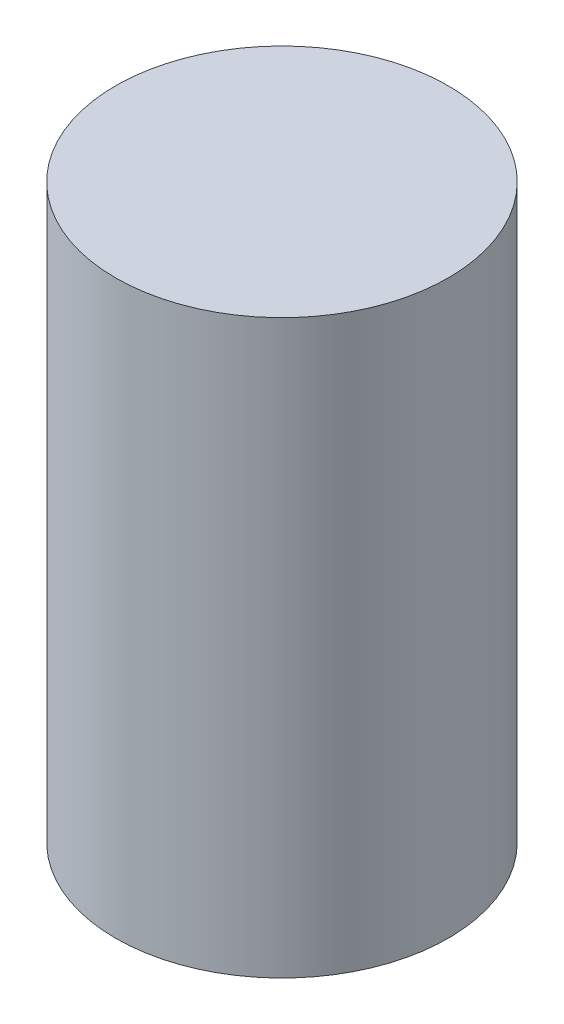
ISO-10303-21;
HEADER;
FILE_DESCRIPTION(('STEP AP214'),'2;1');
FILE_NAME('part.step','',(''),(''),'','','');
FILE_SCHEMA(('AUTOMOTIVE_DESIGN { 1 0 10303 214 1 1 1 1 }'));
ENDSEC;
DATA;
#1=APPLICATION_CONTEXT('core data for automotive mechanical design processes');
#2=APPLICATION_PROTOCOL_DEFINITION('international standard','automotive_design',2000,#1);
#3=PRODUCT_CONTEXT('',#1,'mechanical');
#4=PRODUCT('Part','Part','',(#3));
#5=PRODUCT_RELATED_PRODUCT_CATEGORY('part','',(#4));
#6=PRODUCT_DEFINITION_FORMATION('','',#4);
#7=PRODUCT_DEFINITION_CONTEXT('part definition',#1,'design');
#8=PRODUCT_DEFINITION('design','',#6,#7);
#9=PRODUCT_DEFINITION_SHAPE('','',#8);
#10=(LENGTH_UNIT() NAMED_UNIT(*) SI_UNIT(.MILLI.,.METRE.));
#11=(NAMED_UNIT(*) PLANE_ANGLE_UNIT() SI_UNIT($,.RADIAN.));
#12=(NAMED_UNIT(*) SI_UNIT($,.STERADIAN.) SOLID_ANGLE_UNIT());
#13=UNCERTAINTY_MEASURE_WITH_UNIT(LENGTH_MEASURE(1.E-05),#10,'distance_accuracy_value','');
#14=(GEOMETRIC_REPRESENTATION_CONTEXT(3) GLOBAL_UNCERTAINTY_ASSIGNED_CONTEXT((#13)) GLOBAL_UNIT_ASSIGNED_CONTEXT((#10,
#11,#12)) REPRESENTATION_CONTEXT('',''));
#15=CARTESIAN_POINT('',(0.,0.,0.));
#16=DIRECTION('',(0.,0.,1.));
#17=DIRECTION('',(1.,0.,0.));
#18=AXIS2_PLACEMENT_3D('',#15,#16,#17);
#19=CARTESIAN_POINT('',(0.,13.75,0.));
#20=DIRECTION('',(0.,-1.,0.));
#21=DIRECTION('',(0.,0.,-1.));
#22=AXIS2_PLACEMENT_3D('',#19,#20,#21);
#23=CYLINDRICAL_SURFACE('',#22,4.);
#24=CARTESIAN_POINT('',(0.,13.75,0.));
#25=DIRECTION('',(0.,1.,0.));
#26=DIRECTION('',(0.,0.,1.));
#27=AXIS2_PLACEMENT_3D('',#24,#25,#26);
#28=CIRCLE('',#27,4.);
#29=CARTESIAN_POINT('',(0.,13.75,4.));
#30=VERTEX_POINT('',#29);
#31=EDGE_CURVE('E10',#30,#30,#28,.T.);
#32=ORIENTED_EDGE('',*,*,#31,.F.);
#33=EDGE_LOOP('',(#32));
#34=FACE_BOUND('',#33,.T.);
#35=CARTESIAN_POINT('',(0.,0.,0.));
#36=DIRECTION('',(0.,1.,0.));
#37=DIRECTION('',(0.,0.,1.));
#38=AXIS2_PLACEMENT_3D('',#35,#36,#37);
#39=CIRCLE('',#38,4.);
#40=CARTESIAN_POINT('',(0.,0.,4.));
#41=VERTEX_POINT('',#40);
#42=EDGE_CURVE('E35',#41,#41,#39,.T.);
#43=ORIENTED_EDGE('',*,*,#42,.T.);
#44=EDGE_LOOP('',(#43));
#45=FACE_BOUND('',#44,.T.);
#46=ADVANCED_FACE('F32',(#34,#45),#23,.T.);
#47=CARTESIAN_POINT('',(0.,13.75,0.));
#48=DIRECTION('',(0.,1.,0.));
#49=DIRECTION('',(0.,0.,1.));
#50=AXIS2_PLACEMENT_3D('',#47,#48,#49);
#51=PLANE('',#50);
#52=ORIENTED_EDGE('',*,*,#31,.T.);
#53=EDGE_LOOP('',(#52));
#54=FACE_BOUND('',#53,.T.);
#55=ADVANCED_FACE('F47',(#54),#51,.T.);
#56=CARTESIAN_POINT('',(0.,0.,0.));
#57=DIRECTION('',(0.,1.,0.));
#58=DIRECTION('',(0.,0.,1.));
#59=AXIS2_PLACEMENT_3D('',#56,#57,#58);
#60=PLANE('',#59);
#61=ORIENTED_EDGE('',*,*,#42,.F.);
#62=EDGE_LOOP('',(#61));
#63=FACE_BOUND('',#62,.T.);
#64=ADVANCED_FACE('F45',(#63),#60,.F.);
#65=CLOSED_SHELL('',(#46,#55,#64));
#66=MANIFOLD_SOLID_BREP('B2',#65);
#67=ADVANCED_BREP_SHAPE_REPRESENTATION('',(#18,#66),#14);
#68=SHAPE_DEFINITION_REPRESENTATION(#9,#67);
ENDSEC;
END-ISO-10303-21;
